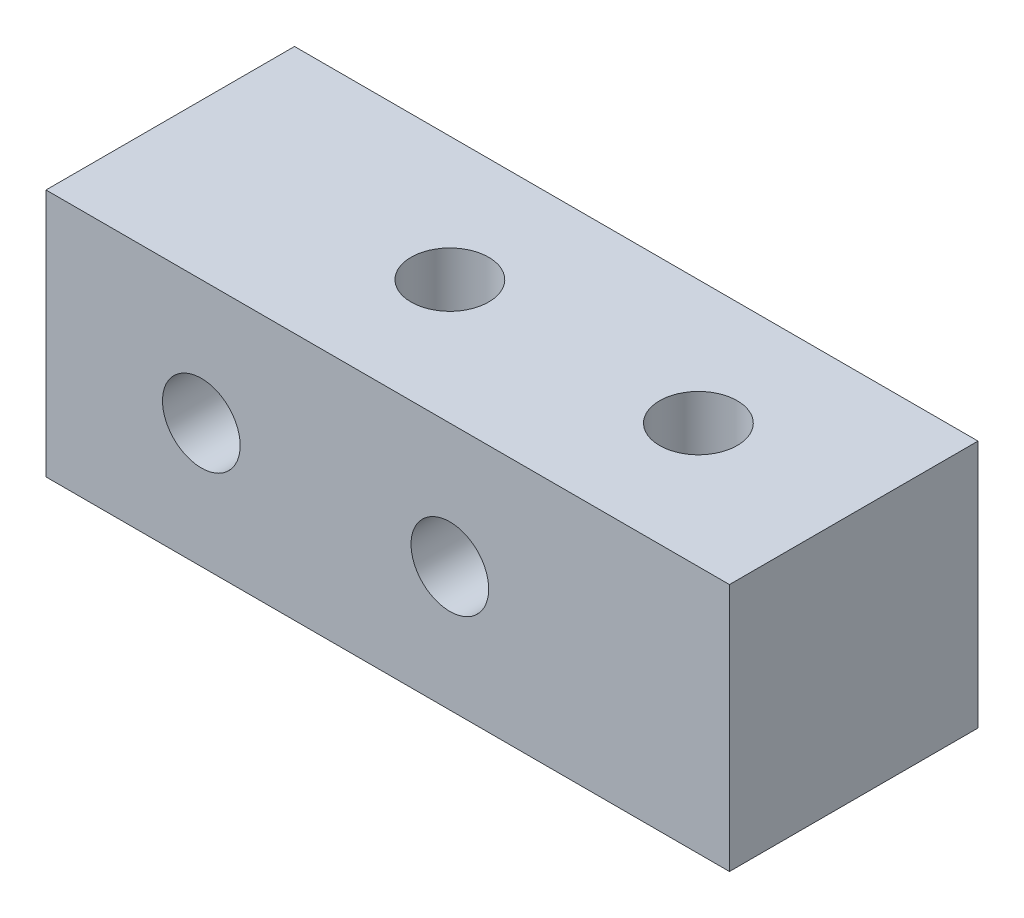
ISO-10303-21;
HEADER;
FILE_DESCRIPTION(('STEP AP214'),'2;1');
FILE_NAME('part.step','',(''),(''),'','','');
FILE_SCHEMA(('AUTOMOTIVE_DESIGN { 1 0 10303 214 1 1 1 1 }'));
ENDSEC;
DATA;
#1=APPLICATION_CONTEXT('core data for automotive mechanical design processes');
#2=APPLICATION_PROTOCOL_DEFINITION('international standard','automotive_design',2000,#1);
#3=PRODUCT_CONTEXT('',#1,'mechanical');
#4=PRODUCT('Part','Part','',(#3));
#5=PRODUCT_RELATED_PRODUCT_CATEGORY('part','',(#4));
#6=PRODUCT_DEFINITION_FORMATION('','',#4);
#7=PRODUCT_DEFINITION_CONTEXT('part definition',#1,'design');
#8=PRODUCT_DEFINITION('design','',#6,#7);
#9=PRODUCT_DEFINITION_SHAPE('','',#8);
#10=(LENGTH_UNIT() NAMED_UNIT(*) SI_UNIT(.MILLI.,.METRE.));
#11=(NAMED_UNIT(*) PLANE_ANGLE_UNIT() SI_UNIT($,.RADIAN.));
#12=(NAMED_UNIT(*) SI_UNIT($,.STERADIAN.) SOLID_ANGLE_UNIT());
#13=UNCERTAINTY_MEASURE_WITH_UNIT(LENGTH_MEASURE(1.E-05),#10,'distance_accuracy_value','');
#14=(GEOMETRIC_REPRESENTATION_CONTEXT(3) GLOBAL_UNCERTAINTY_ASSIGNED_CONTEXT((#13)) GLOBAL_UNIT_ASSIGNED_CONTEXT((#10,
#11,#12)) REPRESENTATION_CONTEXT('',''));
#15=CARTESIAN_POINT('',(0.,0.,0.));
#16=DIRECTION('',(0.,0.,1.));
#17=DIRECTION('',(1.,0.,0.));
#18=AXIS2_PLACEMENT_3D('',#15,#16,#17);
#19=CARTESIAN_POINT('',(-11.,-4.,8.));
#20=DIRECTION('',(1.,0.,0.));
#21=DIRECTION('',(0.,0.,-1.));
#22=AXIS2_PLACEMENT_3D('',#19,#20,#21);
#23=PLANE('',#22);
#24=DIRECTION('',(0.,-1.,0.));
#25=VECTOR('',#24,1.);
#26=CARTESIAN_POINT('',(-11.,-4.,0.));
#27=LINE('',#26,#25);
#28=CARTESIAN_POINT('',(-11.,4.,0.));
#29=VERTEX_POINT('',#28);
#30=CARTESIAN_POINT('',(-11.,-4.,0.));
#31=VERTEX_POINT('',#30);
#32=EDGE_CURVE('E106',#29,#31,#27,.T.);
#33=ORIENTED_EDGE('',*,*,#32,.T.);
#34=DIRECTION('',(0.,0.,-1.));
#35=VECTOR('',#34,1.);
#36=CARTESIAN_POINT('',(-11.,-4.,8.));
#37=LINE('',#36,#35);
#38=CARTESIAN_POINT('',(-11.,-4.,8.));
#39=VERTEX_POINT('',#38);
#40=EDGE_CURVE('E11',#39,#31,#37,.T.);
#41=ORIENTED_EDGE('',*,*,#40,.F.);
#42=DIRECTION('',(0.,-1.,0.));
#43=VECTOR('',#42,1.);
#44=CARTESIAN_POINT('',(-11.,-4.,8.));
#45=LINE('',#44,#43);
#46=CARTESIAN_POINT('',(-11.,4.,8.));
#47=VERTEX_POINT('',#46);
#48=EDGE_CURVE('E90',#47,#39,#45,.T.);
#49=ORIENTED_EDGE('',*,*,#48,.F.);
#50=DIRECTION('',(0.,0.,-1.));
#51=VECTOR('',#50,1.);
#52=CARTESIAN_POINT('',(-11.,4.,8.));
#53=LINE('',#52,#51);
#54=EDGE_CURVE('E102',#47,#29,#53,.T.);
#55=ORIENTED_EDGE('',*,*,#54,.T.);
#56=EDGE_LOOP('',(#33,#41,#49,#55));
#57=FACE_BOUND('',#56,.T.);
#58=ADVANCED_FACE('F38',(#57),#23,.F.);
#59=CARTESIAN_POINT('',(11.,-4.,8.));
#60=DIRECTION('',(0.,1.,0.));
#61=DIRECTION('',(-1.,0.,0.));
#62=AXIS2_PLACEMENT_3D('',#59,#60,#61);
#63=PLANE('',#62);
#64=CARTESIAN_POINT('',(-2.,-4.,4.));
#65=DIRECTION('',(0.,1.,0.));
#66=DIRECTION('',(0.,0.,1.));
#67=AXIS2_PLACEMENT_3D('',#64,#65,#66);
#68=CIRCLE('',#67,1.25);
#69=CARTESIAN_POINT('',(-2.,-4.,5.25));
#70=VERTEX_POINT('',#69);
#71=EDGE_CURVE('E150',#70,#70,#68,.T.);
#72=ORIENTED_EDGE('',*,*,#71,.T.);
#73=EDGE_LOOP('',(#72));
#74=FACE_BOUND('',#73,.T.);
#75=CARTESIAN_POINT('',(6.,-4.,4.));
#76=DIRECTION('',(0.,1.,0.));
#77=DIRECTION('',(0.,0.,1.));
#78=AXIS2_PLACEMENT_3D('',#75,#76,#77);
#79=CIRCLE('',#78,1.25);
#80=CARTESIAN_POINT('',(6.,-4.,5.25));
#81=VERTEX_POINT('',#80);
#82=EDGE_CURVE('E142',#81,#81,#79,.T.);
#83=ORIENTED_EDGE('',*,*,#82,.T.);
#84=EDGE_LOOP('',(#83));
#85=FACE_BOUND('',#84,.T.);
#86=DIRECTION('',(1.,0.,0.));
#87=VECTOR('',#86,1.);
#88=CARTESIAN_POINT('',(11.,-4.,0.));
#89=LINE('',#88,#87);
#90=CARTESIAN_POINT('',(11.,-4.,0.));
#91=VERTEX_POINT('',#90);
#92=EDGE_CURVE('E95',#31,#91,#89,.T.);
#93=ORIENTED_EDGE('',*,*,#92,.T.);
#94=DIRECTION('',(0.,0.,-1.));
#95=VECTOR('',#94,1.);
#96=CARTESIAN_POINT('',(11.,-4.,8.));
#97=LINE('',#96,#95);
#98=CARTESIAN_POINT('',(11.,-4.,8.));
#99=VERTEX_POINT('',#98);
#100=EDGE_CURVE('E47',#99,#91,#97,.T.);
#101=ORIENTED_EDGE('',*,*,#100,.F.);
#102=DIRECTION('',(1.,0.,0.));
#103=VECTOR('',#102,1.);
#104=CARTESIAN_POINT('',(11.,-4.,8.));
#105=LINE('',#104,#103);
#106=EDGE_CURVE('E85',#39,#99,#105,.T.);
#107=ORIENTED_EDGE('',*,*,#106,.F.);
#108=ORIENTED_EDGE('',*,*,#40,.T.);
#109=EDGE_LOOP('',(#93,#101,#107,#108));
#110=FACE_BOUND('',#109,.T.);
#111=ADVANCED_FACE('F94',(#74,#85,#110),#63,.F.);
#112=CARTESIAN_POINT('',(11.,-4.,8.));
#113=DIRECTION('',(-1.,0.,0.));
#114=DIRECTION('',(0.,0.,1.));
#115=AXIS2_PLACEMENT_3D('',#112,#113,#114);
#116=PLANE('',#115);
#117=DIRECTION('',(0.,1.,0.));
#118=VECTOR('',#117,1.);
#119=CARTESIAN_POINT('',(11.,-4.,0.));
#120=LINE('',#119,#118);
#121=CARTESIAN_POINT('',(11.,4.,0.));
#122=VERTEX_POINT('',#121);
#123=EDGE_CURVE('E72',#91,#122,#120,.T.);
#124=ORIENTED_EDGE('',*,*,#123,.T.);
#125=DIRECTION('',(0.,0.,-1.));
#126=VECTOR('',#125,1.);
#127=CARTESIAN_POINT('',(11.,4.,8.));
#128=LINE('',#127,#126);
#129=CARTESIAN_POINT('',(11.,4.,8.));
#130=VERTEX_POINT('',#129);
#131=EDGE_CURVE('E97',#130,#122,#128,.T.);
#132=ORIENTED_EDGE('',*,*,#131,.F.);
#133=DIRECTION('',(0.,1.,0.));
#134=VECTOR('',#133,1.);
#135=CARTESIAN_POINT('',(11.,-4.,8.));
#136=LINE('',#135,#134);
#137=EDGE_CURVE('E88',#99,#130,#136,.T.);
#138=ORIENTED_EDGE('',*,*,#137,.F.);
#139=ORIENTED_EDGE('',*,*,#100,.T.);
#140=EDGE_LOOP('',(#124,#132,#138,#139));
#141=FACE_BOUND('',#140,.T.);
#142=ADVANCED_FACE('F98',(#141),#116,.F.);
#143=CARTESIAN_POINT('',(11.,4.,8.));
#144=DIRECTION('',(0.,-1.,0.));
#145=DIRECTION('',(1.,0.,0.));
#146=AXIS2_PLACEMENT_3D('',#143,#144,#145);
#147=PLANE('',#146);
#148=CARTESIAN_POINT('',(-2.,4.,4.));
#149=DIRECTION('',(0.,1.,0.));
#150=DIRECTION('',(0.,0.,1.));
#151=AXIS2_PLACEMENT_3D('',#148,#149,#150);
#152=CIRCLE('',#151,1.25);
#153=CARTESIAN_POINT('',(-2.,4.,5.25));
#154=VERTEX_POINT('',#153);
#155=EDGE_CURVE('E154',#154,#154,#152,.T.);
#156=ORIENTED_EDGE('',*,*,#155,.F.);
#157=EDGE_LOOP('',(#156));
#158=FACE_BOUND('',#157,.T.);
#159=CARTESIAN_POINT('',(6.,4.,4.));
#160=DIRECTION('',(0.,1.,0.));
#161=DIRECTION('',(0.,0.,1.));
#162=AXIS2_PLACEMENT_3D('',#159,#160,#161);
#163=CIRCLE('',#162,1.25);
#164=CARTESIAN_POINT('',(6.,4.,5.25));
#165=VERTEX_POINT('',#164);
#166=EDGE_CURVE('E146',#165,#165,#163,.T.);
#167=ORIENTED_EDGE('',*,*,#166,.F.);
#168=EDGE_LOOP('',(#167));
#169=FACE_BOUND('',#168,.T.);
#170=DIRECTION('',(-1.,0.,0.));
#171=VECTOR('',#170,1.);
#172=CARTESIAN_POINT('',(11.,4.,0.));
#173=LINE('',#172,#171);
#174=EDGE_CURVE('E78',#122,#29,#173,.T.);
#175=ORIENTED_EDGE('',*,*,#174,.T.);
#176=ORIENTED_EDGE('',*,*,#54,.F.);
#177=DIRECTION('',(-1.,0.,0.));
#178=VECTOR('',#177,1.);
#179=CARTESIAN_POINT('',(11.,4.,8.));
#180=LINE('',#179,#178);
#181=EDGE_CURVE('E55',#130,#47,#180,.T.);
#182=ORIENTED_EDGE('',*,*,#181,.F.);
#183=ORIENTED_EDGE('',*,*,#131,.T.);
#184=EDGE_LOOP('',(#175,#176,#182,#183));
#185=FACE_BOUND('',#184,.T.);
#186=ADVANCED_FACE('F120',(#158,#169,#185),#147,.F.);
#187=CARTESIAN_POINT('',(0.,0.,8.));
#188=DIRECTION('',(0.,0.,1.));
#189=DIRECTION('',(1.,0.,0.));
#190=AXIS2_PLACEMENT_3D('',#187,#188,#189);
#191=PLANE('',#190);
#192=CARTESIAN_POINT('',(2.00000000000001,0.,8.));
#193=DIRECTION('',(0.,0.,1.));
#194=DIRECTION('',(1.,0.,0.));
#195=AXIS2_PLACEMENT_3D('',#192,#193,#194);
#196=CIRCLE('',#195,1.25);
#197=CARTESIAN_POINT('',(3.25000000000001,0.,8.));
#198=VERTEX_POINT('',#197);
#199=EDGE_CURVE('E138',#198,#198,#196,.T.);
#200=ORIENTED_EDGE('',*,*,#199,.F.);
#201=EDGE_LOOP('',(#200));
#202=FACE_BOUND('',#201,.T.);
#203=CARTESIAN_POINT('',(-5.99999999999999,0.,8.));
#204=DIRECTION('',(0.,0.,1.));
#205=DIRECTION('',(1.,0.,0.));
#206=AXIS2_PLACEMENT_3D('',#203,#204,#205);
#207=CIRCLE('',#206,1.25);
#208=CARTESIAN_POINT('',(-4.74999999999999,0.,8.));
#209=VERTEX_POINT('',#208);
#210=EDGE_CURVE('E130',#209,#209,#207,.T.);
#211=ORIENTED_EDGE('',*,*,#210,.F.);
#212=EDGE_LOOP('',(#211));
#213=FACE_BOUND('',#212,.T.);
#214=ORIENTED_EDGE('',*,*,#48,.T.);
#215=ORIENTED_EDGE('',*,*,#106,.T.);
#216=ORIENTED_EDGE('',*,*,#137,.T.);
#217=ORIENTED_EDGE('',*,*,#181,.T.);
#218=EDGE_LOOP('',(#214,#215,#216,#217));
#219=FACE_BOUND('',#218,.T.);
#220=ADVANCED_FACE('F86',(#202,#213,#219),#191,.T.);
#221=CARTESIAN_POINT('',(0.,0.,0.));
#222=DIRECTION('',(0.,0.,1.));
#223=DIRECTION('',(1.,0.,0.));
#224=AXIS2_PLACEMENT_3D('',#221,#222,#223);
#225=PLANE('',#224);
#226=CARTESIAN_POINT('',(2.00000000000001,0.,0.));
#227=DIRECTION('',(0.,0.,1.));
#228=DIRECTION('',(1.,0.,0.));
#229=AXIS2_PLACEMENT_3D('',#226,#227,#228);
#230=CIRCLE('',#229,1.25);
#231=CARTESIAN_POINT('',(3.25,0.,0.));
#232=VERTEX_POINT('',#231);
#233=EDGE_CURVE('E134',#232,#232,#230,.T.);
#234=ORIENTED_EDGE('',*,*,#233,.T.);
#235=EDGE_LOOP('',(#234));
#236=FACE_BOUND('',#235,.T.);
#237=CARTESIAN_POINT('',(-5.99999999999999,0.,0.));
#238=DIRECTION('',(0.,0.,1.));
#239=DIRECTION('',(1.,0.,0.));
#240=AXIS2_PLACEMENT_3D('',#237,#238,#239);
#241=CIRCLE('',#240,1.25);
#242=CARTESIAN_POINT('',(-4.74999999999999,0.,0.));
#243=VERTEX_POINT('',#242);
#244=EDGE_CURVE('E110',#243,#243,#241,.T.);
#245=ORIENTED_EDGE('',*,*,#244,.T.);
#246=EDGE_LOOP('',(#245));
#247=FACE_BOUND('',#246,.T.);
#248=ORIENTED_EDGE('',*,*,#32,.F.);
#249=ORIENTED_EDGE('',*,*,#174,.F.);
#250=ORIENTED_EDGE('',*,*,#123,.F.);
#251=ORIENTED_EDGE('',*,*,#92,.F.);
#252=EDGE_LOOP('',(#248,#249,#250,#251));
#253=FACE_BOUND('',#252,.T.);
#254=ADVANCED_FACE('F123',(#236,#247,#253),#225,.F.);
#255=CARTESIAN_POINT('',(-5.99999999999999,0.,8.));
#256=DIRECTION('',(0.,0.,1.));
#257=DIRECTION('',(1.,0.,0.));
#258=AXIS2_PLACEMENT_3D('',#255,#256,#257);
#259=CYLINDRICAL_SURFACE('',#258,1.25);
#260=ORIENTED_EDGE('',*,*,#244,.F.);
#261=EDGE_LOOP('',(#260));
#262=FACE_BOUND('',#261,.T.);
#263=ORIENTED_EDGE('',*,*,#210,.T.);
#264=EDGE_LOOP('',(#263));
#265=FACE_BOUND('',#264,.T.);
#266=ADVANCED_FACE('F177',(#262,#265),#259,.F.);
#267=CARTESIAN_POINT('',(2.00000000000001,0.,8.));
#268=DIRECTION('',(0.,0.,1.));
#269=DIRECTION('',(1.,0.,0.));
#270=AXIS2_PLACEMENT_3D('',#267,#268,#269);
#271=CYLINDRICAL_SURFACE('',#270,1.25);
#272=ORIENTED_EDGE('',*,*,#233,.F.);
#273=EDGE_LOOP('',(#272));
#274=FACE_BOUND('',#273,.T.);
#275=ORIENTED_EDGE('',*,*,#199,.T.);
#276=EDGE_LOOP('',(#275));
#277=FACE_BOUND('',#276,.T.);
#278=ADVANCED_FACE('F168',(#274,#277),#271,.F.);
#279=CARTESIAN_POINT('',(6.,4.,4.));
#280=DIRECTION('',(0.,1.,0.));
#281=DIRECTION('',(0.,0.,1.));
#282=AXIS2_PLACEMENT_3D('',#279,#280,#281);
#283=CYLINDRICAL_SURFACE('',#282,1.25);
#284=ORIENTED_EDGE('',*,*,#82,.F.);
#285=EDGE_LOOP('',(#284));
#286=FACE_BOUND('',#285,.T.);
#287=ORIENTED_EDGE('',*,*,#166,.T.);
#288=EDGE_LOOP('',(#287));
#289=FACE_BOUND('',#288,.T.);
#290=ADVANCED_FACE('F166',(#286,#289),#283,.F.);
#291=CARTESIAN_POINT('',(-2.,4.,4.));
#292=DIRECTION('',(0.,1.,0.));
#293=DIRECTION('',(0.,0.,1.));
#294=AXIS2_PLACEMENT_3D('',#291,#292,#293);
#295=CYLINDRICAL_SURFACE('',#294,1.25);
#296=ORIENTED_EDGE('',*,*,#71,.F.);
#297=EDGE_LOOP('',(#296));
#298=FACE_BOUND('',#297,.T.);
#299=ORIENTED_EDGE('',*,*,#155,.T.);
#300=EDGE_LOOP('',(#299));
#301=FACE_BOUND('',#300,.T.);
#302=ADVANCED_FACE('F159',(#298,#301),#295,.F.);
#303=CLOSED_SHELL('',(#58,#111,#142,#186,#220,#254,#266,#278,#290,#302));
#304=MANIFOLD_SOLID_BREP('B2',#303);
#305=ADVANCED_BREP_SHAPE_REPRESENTATION('',(#18,#304),#14);
#306=SHAPE_DEFINITION_REPRESENTATION(#9,#305);
ENDSEC;
END-ISO-10303-21;
